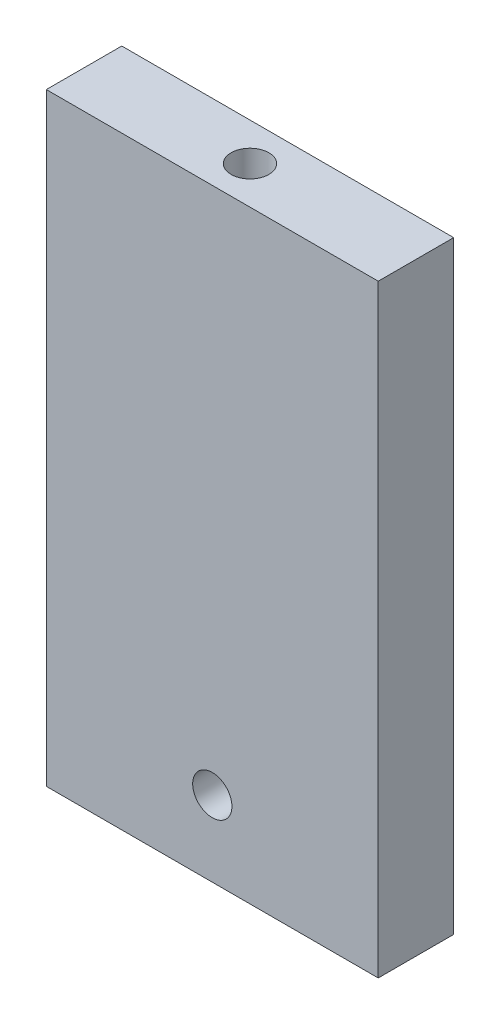
ISO-10303-21;
HEADER;
FILE_DESCRIPTION(('STEP AP214'),'2;1');
FILE_NAME('part.step','',(''),(''),'','','');
FILE_SCHEMA(('AUTOMOTIVE_DESIGN { 1 0 10303 214 1 1 1 1 }'));
ENDSEC;
DATA;
#1=APPLICATION_CONTEXT('core data for automotive mechanical design processes');
#2=APPLICATION_PROTOCOL_DEFINITION('international standard','automotive_design',2000,#1);
#3=PRODUCT_CONTEXT('',#1,'mechanical');
#4=PRODUCT('Part','Part','',(#3));
#5=PRODUCT_RELATED_PRODUCT_CATEGORY('part','',(#4));
#6=PRODUCT_DEFINITION_FORMATION('','',#4);
#7=PRODUCT_DEFINITION_CONTEXT('part definition',#1,'design');
#8=PRODUCT_DEFINITION('design','',#6,#7);
#9=PRODUCT_DEFINITION_SHAPE('','',#8);
#10=(LENGTH_UNIT() NAMED_UNIT(*) SI_UNIT(.MILLI.,.METRE.));
#11=(NAMED_UNIT(*) PLANE_ANGLE_UNIT() SI_UNIT($,.RADIAN.));
#12=(NAMED_UNIT(*) SI_UNIT($,.STERADIAN.) SOLID_ANGLE_UNIT());
#13=UNCERTAINTY_MEASURE_WITH_UNIT(LENGTH_MEASURE(1.E-05),#10,'distance_accuracy_value','');
#14=(GEOMETRIC_REPRESENTATION_CONTEXT(3) GLOBAL_UNCERTAINTY_ASSIGNED_CONTEXT((#13)) GLOBAL_UNIT_ASSIGNED_CONTEXT((#10,
#11,#12)) REPRESENTATION_CONTEXT('',''));
#15=CARTESIAN_POINT('',(0.,0.,0.));
#16=DIRECTION('',(0.,0.,1.));
#17=DIRECTION('',(1.,0.,0.));
#18=AXIS2_PLACEMENT_3D('',#15,#16,#17);
#19=CARTESIAN_POINT('',(11.,20.,2.5));
#20=DIRECTION('',(-1.,0.,0.));
#21=DIRECTION('',(0.,-1.,0.));
#22=AXIS2_PLACEMENT_3D('',#19,#20,#21);
#23=PLANE('',#22);
#24=DIRECTION('',(0.,1.,0.));
#25=VECTOR('',#24,1.);
#26=CARTESIAN_POINT('',(11.,20.,-2.5));
#27=LINE('',#26,#25);
#28=CARTESIAN_POINT('',(11.,-20.,-2.5));
#29=VERTEX_POINT('',#28);
#30=CARTESIAN_POINT('',(11.,20.,-2.5));
#31=VERTEX_POINT('',#30);
#32=EDGE_CURVE('E78',#29,#31,#27,.T.);
#33=ORIENTED_EDGE('',*,*,#32,.T.);
#34=DIRECTION('',(0.,0.,-1.));
#35=VECTOR('',#34,1.);
#36=CARTESIAN_POINT('',(11.,20.,2.5));
#37=LINE('',#36,#35);
#38=CARTESIAN_POINT('',(11.,20.,2.5));
#39=VERTEX_POINT('',#38);
#40=EDGE_CURVE('E11',#39,#31,#37,.T.);
#41=ORIENTED_EDGE('',*,*,#40,.F.);
#42=DIRECTION('',(0.,1.,0.));
#43=VECTOR('',#42,1.);
#44=CARTESIAN_POINT('',(11.,20.,2.5));
#45=LINE('',#44,#43);
#46=CARTESIAN_POINT('',(11.,-20.,2.5));
#47=VERTEX_POINT('',#46);
#48=EDGE_CURVE('E89',#47,#39,#45,.T.);
#49=ORIENTED_EDGE('',*,*,#48,.F.);
#50=DIRECTION('',(0.,0.,-1.));
#51=VECTOR('',#50,1.);
#52=CARTESIAN_POINT('',(11.,-20.,2.5));
#53=LINE('',#52,#51);
#54=EDGE_CURVE('E94',#47,#29,#53,.T.);
#55=ORIENTED_EDGE('',*,*,#54,.T.);
#56=EDGE_LOOP('',(#33,#41,#49,#55));
#57=FACE_BOUND('',#56,.T.);
#58=ADVANCED_FACE('F17',(#57),#23,.F.);
#59=CARTESIAN_POINT('',(-11.,20.,2.5));
#60=DIRECTION('',(0.,-1.,0.));
#61=DIRECTION('',(0.,0.,-1.));
#62=AXIS2_PLACEMENT_3D('',#59,#60,#61);
#63=PLANE('',#62);
#64=CARTESIAN_POINT('',(0.,20.,0.));
#65=DIRECTION('',(0.,1.,0.));
#66=DIRECTION('',(0.,0.,1.));
#67=AXIS2_PLACEMENT_3D('',#64,#65,#66);
#68=CIRCLE('',#67,1.25);
#69=CARTESIAN_POINT('',(0.,20.,1.25));
#70=VERTEX_POINT('',#69);
#71=EDGE_CURVE('E79',#70,#70,#68,.T.);
#72=ORIENTED_EDGE('',*,*,#71,.F.);
#73=EDGE_LOOP('',(#72));
#74=FACE_BOUND('',#73,.T.);
#75=DIRECTION('',(-1.,0.,0.));
#76=VECTOR('',#75,1.);
#77=CARTESIAN_POINT('',(-11.,20.,-2.5));
#78=LINE('',#77,#76);
#79=CARTESIAN_POINT('',(-11.,20.,-2.5));
#80=VERTEX_POINT('',#79);
#81=EDGE_CURVE('E82',#31,#80,#78,.T.);
#82=ORIENTED_EDGE('',*,*,#81,.T.);
#83=DIRECTION('',(0.,0.,-1.));
#84=VECTOR('',#83,1.);
#85=CARTESIAN_POINT('',(-11.,20.,2.5));
#86=LINE('',#85,#84);
#87=CARTESIAN_POINT('',(-11.,20.,2.5));
#88=VERTEX_POINT('',#87);
#89=EDGE_CURVE('E25',#88,#80,#86,.T.);
#90=ORIENTED_EDGE('',*,*,#89,.F.);
#91=DIRECTION('',(-1.,0.,0.));
#92=VECTOR('',#91,1.);
#93=CARTESIAN_POINT('',(-11.,20.,2.5));
#94=LINE('',#93,#92);
#95=EDGE_CURVE('E64',#39,#88,#94,.T.);
#96=ORIENTED_EDGE('',*,*,#95,.F.);
#97=ORIENTED_EDGE('',*,*,#40,.T.);
#98=EDGE_LOOP('',(#82,#90,#96,#97));
#99=FACE_BOUND('',#98,.T.);
#100=ADVANCED_FACE('F120',(#74,#99),#63,.F.);
#101=CARTESIAN_POINT('',(-11.,20.,2.5));
#102=DIRECTION('',(1.,0.,0.));
#103=DIRECTION('',(0.,1.,0.));
#104=AXIS2_PLACEMENT_3D('',#101,#102,#103);
#105=PLANE('',#104);
#106=DIRECTION('',(0.,-1.,0.));
#107=VECTOR('',#106,1.);
#108=CARTESIAN_POINT('',(-11.,20.,-2.5));
#109=LINE('',#108,#107);
#110=CARTESIAN_POINT('',(-11.,-20.,-2.5));
#111=VERTEX_POINT('',#110);
#112=EDGE_CURVE('E51',#80,#111,#109,.T.);
#113=ORIENTED_EDGE('',*,*,#112,.T.);
#114=DIRECTION('',(0.,0.,-1.));
#115=VECTOR('',#114,1.);
#116=CARTESIAN_POINT('',(-11.,-20.,2.5));
#117=LINE('',#116,#115);
#118=CARTESIAN_POINT('',(-11.,-20.,2.5));
#119=VERTEX_POINT('',#118);
#120=EDGE_CURVE('E100',#119,#111,#117,.T.);
#121=ORIENTED_EDGE('',*,*,#120,.F.);
#122=DIRECTION('',(0.,-1.,0.));
#123=VECTOR('',#122,1.);
#124=CARTESIAN_POINT('',(-11.,20.,2.5));
#125=LINE('',#124,#123);
#126=EDGE_CURVE('E92',#88,#119,#125,.T.);
#127=ORIENTED_EDGE('',*,*,#126,.F.);
#128=ORIENTED_EDGE('',*,*,#89,.T.);
#129=EDGE_LOOP('',(#113,#121,#127,#128));
#130=FACE_BOUND('',#129,.T.);
#131=ADVANCED_FACE('F102',(#130),#105,.F.);
#132=CARTESIAN_POINT('',(-11.,-20.,2.5));
#133=DIRECTION('',(0.,1.,0.));
#134=DIRECTION('',(0.,0.,1.));
#135=AXIS2_PLACEMENT_3D('',#132,#133,#134);
#136=PLANE('',#135);
#137=DIRECTION('',(1.,0.,0.));
#138=VECTOR('',#137,1.);
#139=CARTESIAN_POINT('',(-11.,-20.,-2.5));
#140=LINE('',#139,#138);
#141=EDGE_CURVE('E57',#111,#29,#140,.T.);
#142=ORIENTED_EDGE('',*,*,#141,.T.);
#143=ORIENTED_EDGE('',*,*,#54,.F.);
#144=DIRECTION('',(1.,0.,0.));
#145=VECTOR('',#144,1.);
#146=CARTESIAN_POINT('',(-11.,-20.,2.5));
#147=LINE('',#146,#145);
#148=EDGE_CURVE('E33',#119,#47,#147,.T.);
#149=ORIENTED_EDGE('',*,*,#148,.F.);
#150=ORIENTED_EDGE('',*,*,#120,.T.);
#151=EDGE_LOOP('',(#142,#143,#149,#150));
#152=FACE_BOUND('',#151,.T.);
#153=ADVANCED_FACE('F108',(#152),#136,.F.);
#154=CARTESIAN_POINT('',(0.,0.,2.5));
#155=DIRECTION('',(0.,0.,1.));
#156=DIRECTION('',(1.,0.,0.));
#157=AXIS2_PLACEMENT_3D('',#154,#155,#156);
#158=PLANE('',#157);
#159=CARTESIAN_POINT('',(0.,-15.,2.5));
#160=DIRECTION('',(0.,0.,1.));
#161=DIRECTION('',(1.,0.,0.));
#162=AXIS2_PLACEMENT_3D('',#159,#160,#161);
#163=CIRCLE('',#162,1.3);
#164=CARTESIAN_POINT('',(1.3,-15.,2.5));
#165=VERTEX_POINT('',#164);
#166=EDGE_CURVE('E150',#165,#165,#163,.T.);
#167=ORIENTED_EDGE('',*,*,#166,.F.);
#168=EDGE_LOOP('',(#167));
#169=FACE_BOUND('',#168,.T.);
#170=ORIENTED_EDGE('',*,*,#48,.T.);
#171=ORIENTED_EDGE('',*,*,#95,.T.);
#172=ORIENTED_EDGE('',*,*,#126,.T.);
#173=ORIENTED_EDGE('',*,*,#148,.T.);
#174=EDGE_LOOP('',(#170,#171,#172,#173));
#175=FACE_BOUND('',#174,.T.);
#176=ADVANCED_FACE('F110',(#169,#175),#158,.T.);
#177=CARTESIAN_POINT('',(0.,0.,-2.5));
#178=DIRECTION('',(0.,0.,1.));
#179=DIRECTION('',(1.,0.,0.));
#180=AXIS2_PLACEMENT_3D('',#177,#178,#179);
#181=PLANE('',#180);
#182=CARTESIAN_POINT('',(0.,-15.,-2.5));
#183=DIRECTION('',(0.,0.,1.));
#184=DIRECTION('',(1.,0.,0.));
#185=AXIS2_PLACEMENT_3D('',#182,#183,#184);
#186=CIRCLE('',#185,1.3);
#187=CARTESIAN_POINT('',(1.3,-15.,-2.5));
#188=VERTEX_POINT('',#187);
#189=EDGE_CURVE('E85',#188,#188,#186,.T.);
#190=ORIENTED_EDGE('',*,*,#189,.T.);
#191=EDGE_LOOP('',(#190));
#192=FACE_BOUND('',#191,.T.);
#193=ORIENTED_EDGE('',*,*,#32,.F.);
#194=ORIENTED_EDGE('',*,*,#141,.F.);
#195=ORIENTED_EDGE('',*,*,#112,.F.);
#196=ORIENTED_EDGE('',*,*,#81,.F.);
#197=EDGE_LOOP('',(#193,#194,#195,#196));
#198=FACE_BOUND('',#197,.T.);
#199=ADVANCED_FACE('F72',(#192,#198),#181,.F.);
#200=CARTESIAN_POINT('',(0.,12.5,0.));
#201=DIRECTION('',(0.,1.,0.));
#202=DIRECTION('',(0.,0.,1.));
#203=AXIS2_PLACEMENT_3D('',#200,#201,#202);
#204=CONICAL_SURFACE('',#203,1.25,1.02974425867665);
#205=CARTESIAN_POINT('',(0.,11.7489242262155,0.));
#206=VERTEX_POINT('',#205);
#207=VERTEX_LOOP('',#206);
#208=FACE_BOUND('',#207,.T.);
#209=CARTESIAN_POINT('',(0.,12.5,0.));
#210=DIRECTION('',(0.,1.,0.));
#211=DIRECTION('',(0.,0.,1.));
#212=AXIS2_PLACEMENT_3D('',#209,#210,#211);
#213=CIRCLE('',#212,1.25);
#214=CARTESIAN_POINT('',(0.,12.5,1.25));
#215=VERTEX_POINT('',#214);
#216=EDGE_CURVE('E76',#215,#215,#213,.T.);
#217=ORIENTED_EDGE('',*,*,#216,.T.);
#218=EDGE_LOOP('',(#217));
#219=FACE_BOUND('',#218,.T.);
#220=ADVANCED_FACE('F68',(#208,#219),#204,.F.);
#221=CARTESIAN_POINT('',(0.,20.,0.));
#222=DIRECTION('',(0.,1.,0.));
#223=DIRECTION('',(0.,0.,1.));
#224=AXIS2_PLACEMENT_3D('',#221,#222,#223);
#225=CYLINDRICAL_SURFACE('',#224,1.25);
#226=ORIENTED_EDGE('',*,*,#216,.F.);
#227=EDGE_LOOP('',(#226));
#228=FACE_BOUND('',#227,.T.);
#229=ORIENTED_EDGE('',*,*,#71,.T.);
#230=EDGE_LOOP('',(#229));
#231=FACE_BOUND('',#230,.T.);
#232=ADVANCED_FACE('F71',(#228,#231),#225,.F.);
#233=CARTESIAN_POINT('',(0.,-15.,2.5));
#234=DIRECTION('',(0.,0.,1.));
#235=DIRECTION('',(1.,0.,0.));
#236=AXIS2_PLACEMENT_3D('',#233,#234,#235);
#237=CYLINDRICAL_SURFACE('',#236,1.3);
#238=ORIENTED_EDGE('',*,*,#189,.F.);
#239=EDGE_LOOP('',(#238));
#240=FACE_BOUND('',#239,.T.);
#241=ORIENTED_EDGE('',*,*,#166,.T.);
#242=EDGE_LOOP('',(#241));
#243=FACE_BOUND('',#242,.T.);
#244=ADVANCED_FACE('F135',(#240,#243),#237,.F.);
#245=CLOSED_SHELL('',(#58,#100,#131,#153,#176,#199,#220,#232,#244));
#246=MANIFOLD_SOLID_BREP('B1',#245);
#247=ADVANCED_BREP_SHAPE_REPRESENTATION('',(#18,#246),#14);
#248=SHAPE_DEFINITION_REPRESENTATION(#9,#247);
ENDSEC;
END-ISO-10303-21;
